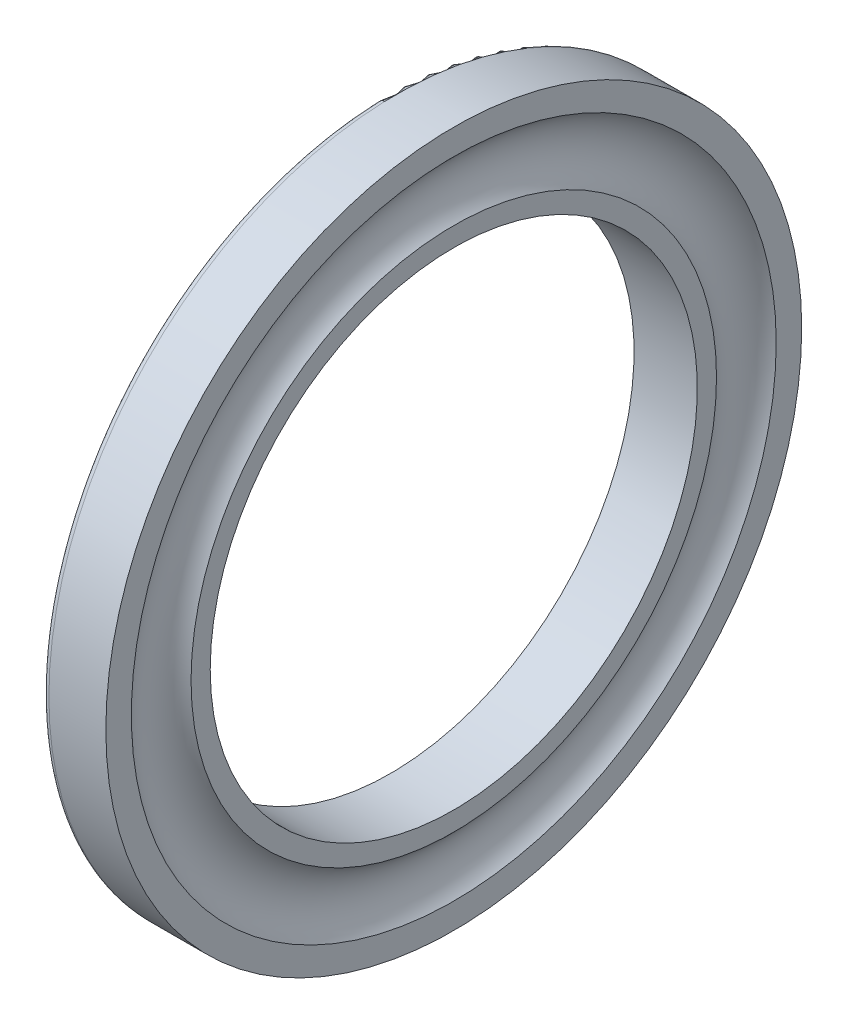
ISO-10303-21;
HEADER;
FILE_DESCRIPTION(('STEP AP214'),'2;1');
FILE_NAME('part.step','',(''),(''),'','','');
FILE_SCHEMA(('AUTOMOTIVE_DESIGN { 1 0 10303 214 1 1 1 1 }'));
ENDSEC;
DATA;
#1=APPLICATION_CONTEXT('core data for automotive mechanical design processes');
#2=APPLICATION_PROTOCOL_DEFINITION('international standard','automotive_design',2000,#1);
#3=PRODUCT_CONTEXT('',#1,'mechanical');
#4=PRODUCT('Part','Part','',(#3));
#5=PRODUCT_RELATED_PRODUCT_CATEGORY('part','',(#4));
#6=PRODUCT_DEFINITION_FORMATION('','',#4);
#7=PRODUCT_DEFINITION_CONTEXT('part definition',#1,'design');
#8=PRODUCT_DEFINITION('design','',#6,#7);
#9=PRODUCT_DEFINITION_SHAPE('','',#8);
#10=(LENGTH_UNIT() NAMED_UNIT(*) SI_UNIT(.MILLI.,.METRE.));
#11=(NAMED_UNIT(*) PLANE_ANGLE_UNIT() SI_UNIT($,.RADIAN.));
#12=(NAMED_UNIT(*) SI_UNIT($,.STERADIAN.) SOLID_ANGLE_UNIT());
#13=UNCERTAINTY_MEASURE_WITH_UNIT(LENGTH_MEASURE(1.E-05),#10,'distance_accuracy_value','');
#14=(GEOMETRIC_REPRESENTATION_CONTEXT(3) GLOBAL_UNCERTAINTY_ASSIGNED_CONTEXT((#13)) GLOBAL_UNIT_ASSIGNED_CONTEXT((#10,
#11,#12)) REPRESENTATION_CONTEXT('',''));
#15=CARTESIAN_POINT('',(0.,0.,0.));
#16=DIRECTION('',(0.,0.,1.));
#17=DIRECTION('',(1.,0.,0.));
#18=AXIS2_PLACEMENT_3D('',#15,#16,#17);
#19=CARTESIAN_POINT('',(14.25,0.,0.));
#20=DIRECTION('',(1.,0.,0.));
#21=DIRECTION('',(0.,0.,-1.));
#22=AXIS2_PLACEMENT_3D('',#19,#20,#21);
#23=TOROIDAL_SURFACE('',#22,46.25,6.35);
#24=CARTESIAN_POINT('',(10.,0.,0.));
#25=DIRECTION('',(1.,0.,0.));
#26=DIRECTION('',(0.,0.,-1.));
#27=AXIS2_PLACEMENT_3D('',#24,#25,#26);
#28=CIRCLE('',#27,50.9680504448342);
#29=CARTESIAN_POINT('',(10.,0.,-50.9680504448342));
#30=VERTEX_POINT('',#29);
#31=EDGE_CURVE('E19',#30,#30,#28,.F.);
#32=ORIENTED_EDGE('',*,*,#31,.F.);
#33=EDGE_LOOP('',(#32));
#34=FACE_BOUND('',#33,.T.);
#35=CARTESIAN_POINT('',(10.,0.,0.));
#36=DIRECTION('',(1.,0.,0.));
#37=DIRECTION('',(0.,0.,-1.));
#38=AXIS2_PLACEMENT_3D('',#35,#36,#37);
#39=CIRCLE('',#38,41.5319495551658);
#40=CARTESIAN_POINT('',(10.,0.,-41.5319495551658));
#41=VERTEX_POINT('',#40);
#42=EDGE_CURVE('E42',#41,#41,#39,.T.);
#43=ORIENTED_EDGE('',*,*,#42,.F.);
#44=EDGE_LOOP('',(#43));
#45=FACE_BOUND('',#44,.T.);
#46=ADVANCED_FACE('F15',(#34,#45),#23,.F.);
#47=CARTESIAN_POINT('',(10.,50.9680504448342,0.));
#48=DIRECTION('',(1.,0.,0.));
#49=DIRECTION('',(0.,0.,-1.));
#50=AXIS2_PLACEMENT_3D('',#47,#48,#49);
#51=PLANE('',#50);
#52=ORIENTED_EDGE('',*,*,#31,.T.);
#53=EDGE_LOOP('',(#52));
#54=FACE_BOUND('',#53,.T.);
#55=CARTESIAN_POINT('',(10.,0.,0.));
#56=DIRECTION('',(-1.,0.,0.));
#57=DIRECTION('',(0.,0.,1.));
#58=AXIS2_PLACEMENT_3D('',#55,#56,#57);
#59=CIRCLE('',#58,55.);
#60=CARTESIAN_POINT('',(10.,0.,55.));
#61=VERTEX_POINT('',#60);
#62=EDGE_CURVE('E40',#61,#61,#59,.T.);
#63=ORIENTED_EDGE('',*,*,#62,.F.);
#64=EDGE_LOOP('',(#63));
#65=FACE_BOUND('',#64,.T.);
#66=ADVANCED_FACE('F49',(#54,#65),#51,.T.);
#67=CARTESIAN_POINT('',(10.,38.5,0.));
#68=DIRECTION('',(1.,0.,0.));
#69=DIRECTION('',(0.,0.,-1.));
#70=AXIS2_PLACEMENT_3D('',#67,#68,#69);
#71=PLANE('',#70);
#72=CARTESIAN_POINT('',(10.,0.,0.));
#73=DIRECTION('',(-1.,0.,0.));
#74=DIRECTION('',(0.,0.,1.));
#75=AXIS2_PLACEMENT_3D('',#72,#73,#74);
#76=CIRCLE('',#75,38.5);
#77=CARTESIAN_POINT('',(10.,0.,38.5));
#78=VERTEX_POINT('',#77);
#79=EDGE_CURVE('E33',#78,#78,#76,.T.);
#80=ORIENTED_EDGE('',*,*,#79,.T.);
#81=EDGE_LOOP('',(#80));
#82=FACE_BOUND('',#81,.T.);
#83=ORIENTED_EDGE('',*,*,#42,.T.);
#84=EDGE_LOOP('',(#83));
#85=FACE_BOUND('',#84,.T.);
#86=ADVANCED_FACE('F58',(#82,#85),#71,.T.);
#87=CARTESIAN_POINT('',(10.,0.,0.));
#88=DIRECTION('',(-1.,0.,0.));
#89=DIRECTION('',(0.,0.,1.));
#90=AXIS2_PLACEMENT_3D('',#87,#88,#89);
#91=CYLINDRICAL_SURFACE('',#90,55.);
#92=ORIENTED_EDGE('',*,*,#62,.T.);
#93=EDGE_LOOP('',(#92));
#94=FACE_BOUND('',#93,.T.);
#95=CARTESIAN_POINT('',(1.00000000000001,0.,0.));
#96=DIRECTION('',(1.,0.,0.));
#97=DIRECTION('',(0.,0.,-1.));
#98=AXIS2_PLACEMENT_3D('',#95,#96,#97);
#99=CIRCLE('',#98,55.);
#100=CARTESIAN_POINT('',(1.00000000000001,0.,-55.));
#101=VERTEX_POINT('',#100);
#102=EDGE_CURVE('E28',#101,#101,#99,.F.);
#103=ORIENTED_EDGE('',*,*,#102,.F.);
#104=EDGE_LOOP('',(#103));
#105=FACE_BOUND('',#104,.T.);
#106=ADVANCED_FACE('F95',(#94,#105),#91,.T.);
#107=CARTESIAN_POINT('',(10.,0.,0.));
#108=DIRECTION('',(-1.,0.,0.));
#109=DIRECTION('',(0.,0.,1.));
#110=AXIS2_PLACEMENT_3D('',#107,#108,#109);
#111=CYLINDRICAL_SURFACE('',#110,38.5);
#112=CARTESIAN_POINT('',(0.,0.,0.));
#113=DIRECTION('',(-1.,0.,0.));
#114=DIRECTION('',(0.,0.,1.));
#115=AXIS2_PLACEMENT_3D('',#112,#113,#114);
#116=CIRCLE('',#115,38.5);
#117=CARTESIAN_POINT('',(0.,0.,38.5));
#118=VERTEX_POINT('',#117);
#119=EDGE_CURVE('E23',#118,#118,#116,.F.);
#120=ORIENTED_EDGE('',*,*,#119,.F.);
#121=EDGE_LOOP('',(#120));
#122=FACE_BOUND('',#121,.T.);
#123=ORIENTED_EDGE('',*,*,#79,.F.);
#124=EDGE_LOOP('',(#123));
#125=FACE_BOUND('',#124,.T.);
#126=ADVANCED_FACE('F66',(#122,#125),#111,.F.);
#127=CARTESIAN_POINT('',(1.00000000000001,0.,0.));
#128=DIRECTION('',(1.,0.,0.));
#129=DIRECTION('',(0.,0.,-1.));
#130=AXIS2_PLACEMENT_3D('',#127,#128,#129);
#131=TOROIDAL_SURFACE('',#130,54.,1.);
#132=ORIENTED_EDGE('',*,*,#102,.T.);
#133=EDGE_LOOP('',(#132));
#134=FACE_BOUND('',#133,.T.);
#135=CARTESIAN_POINT('',(0.,0.,0.));
#136=DIRECTION('',(1.,0.,0.));
#137=DIRECTION('',(0.,0.,-1.));
#138=AXIS2_PLACEMENT_3D('',#135,#136,#137);
#139=CIRCLE('',#138,54.);
#140=CARTESIAN_POINT('',(0.,0.,-54.));
#141=VERTEX_POINT('',#140);
#142=EDGE_CURVE('E10',#141,#141,#139,.F.);
#143=ORIENTED_EDGE('',*,*,#142,.F.);
#144=EDGE_LOOP('',(#143));
#145=FACE_BOUND('',#144,.T.);
#146=ADVANCED_FACE('F61',(#134,#145),#131,.T.);
#147=CARTESIAN_POINT('',(0.,54.,0.));
#148=DIRECTION('',(-1.,0.,0.));
#149=DIRECTION('',(0.,0.,1.));
#150=AXIS2_PLACEMENT_3D('',#147,#148,#149);
#151=PLANE('',#150);
#152=ORIENTED_EDGE('',*,*,#142,.T.);
#153=EDGE_LOOP('',(#152));
#154=FACE_BOUND('',#153,.T.);
#155=ORIENTED_EDGE('',*,*,#119,.T.);
#156=EDGE_LOOP('',(#155));
#157=FACE_BOUND('',#156,.T.);
#158=ADVANCED_FACE('F59',(#154,#157),#151,.T.);
#159=CLOSED_SHELL('',(#46,#66,#86,#106,#126,#146,#158));
#160=MANIFOLD_SOLID_BREP('B1',#159);
#161=ADVANCED_BREP_SHAPE_REPRESENTATION('',(#18,#160),#14);
#162=SHAPE_DEFINITION_REPRESENTATION(#9,#161);
ENDSEC;
END-ISO-10303-21;
